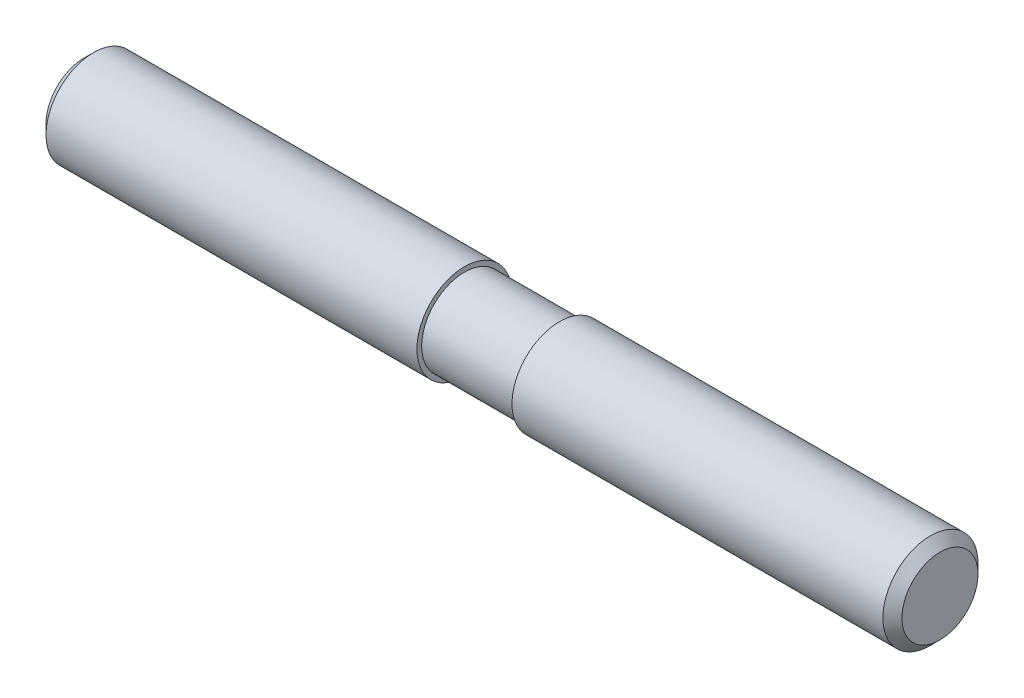
ISO-10303-21;
HEADER;
FILE_DESCRIPTION(('STEP AP214'),'2;1');
FILE_NAME('part.step','',(''),(''),'','','');
FILE_SCHEMA(('AUTOMOTIVE_DESIGN { 1 0 10303 214 1 1 1 1 }'));
ENDSEC;
DATA;
#1=APPLICATION_CONTEXT('core data for automotive mechanical design processes');
#2=APPLICATION_PROTOCOL_DEFINITION('international standard','automotive_design',2000,#1);
#3=PRODUCT_CONTEXT('',#1,'mechanical');
#4=PRODUCT('Part','Part','',(#3));
#5=PRODUCT_RELATED_PRODUCT_CATEGORY('part','',(#4));
#6=PRODUCT_DEFINITION_FORMATION('','',#4);
#7=PRODUCT_DEFINITION_CONTEXT('part definition',#1,'design');
#8=PRODUCT_DEFINITION('design','',#6,#7);
#9=PRODUCT_DEFINITION_SHAPE('','',#8);
#10=(LENGTH_UNIT() NAMED_UNIT(*) SI_UNIT(.MILLI.,.METRE.));
#11=(NAMED_UNIT(*) PLANE_ANGLE_UNIT() SI_UNIT($,.RADIAN.));
#12=(NAMED_UNIT(*) SI_UNIT($,.STERADIAN.) SOLID_ANGLE_UNIT());
#13=UNCERTAINTY_MEASURE_WITH_UNIT(LENGTH_MEASURE(1.E-05),#10,'distance_accuracy_value','');
#14=(GEOMETRIC_REPRESENTATION_CONTEXT(3) GLOBAL_UNCERTAINTY_ASSIGNED_CONTEXT((#13)) GLOBAL_UNIT_ASSIGNED_CONTEXT((#10,
#11,#12)) REPRESENTATION_CONTEXT('',''));
#15=CARTESIAN_POINT('',(0.,0.,0.));
#16=DIRECTION('',(0.,0.,1.));
#17=DIRECTION('',(1.,0.,0.));
#18=AXIS2_PLACEMENT_3D('',#15,#16,#17);
#19=CARTESIAN_POINT('',(-9.,52.9,118.969863647503));
#20=DIRECTION('',(1.,0.,0.));
#21=DIRECTION('',(0.,-0.999989258588651,0.004634944155015));
#22=AXIS2_PLACEMENT_3D('',#19,#20,#21);
#23=CONICAL_SURFACE('',#22,0.8,0.785398163397442);
#24=CARTESIAN_POINT('',(-9.,52.9,118.969863647503));
#25=DIRECTION('',(-1.,0.,0.));
#26=DIRECTION('',(0.,0.999989258588651,-0.004634944155015));
#27=AXIS2_PLACEMENT_3D('',#24,#25,#26);
#28=CIRCLE('',#27,0.8);
#29=CARTESIAN_POINT('',(-9.,53.6999914068709,118.966155692179));
#30=VERTEX_POINT('',#29);
#31=EDGE_CURVE('E83',#30,#30,#28,.T.);
#32=ORIENTED_EDGE('',*,*,#31,.F.);
#33=EDGE_LOOP('',(#32));
#34=FACE_BOUND('',#33,.T.);
#35=CARTESIAN_POINT('',(-8.8,52.9,118.969863647503));
#36=DIRECTION('',(1.,0.,0.));
#37=DIRECTION('',(0.,0.999989258588651,-0.004634944155015));
#38=AXIS2_PLACEMENT_3D('',#35,#36,#37);
#39=CIRCLE('',#38,1.);
#40=CARTESIAN_POINT('',(-8.8,53.8999892585887,118.965228703348));
#41=VERTEX_POINT('',#40);
#42=EDGE_CURVE('E87',#41,#41,#39,.T.);
#43=ORIENTED_EDGE('',*,*,#42,.F.);
#44=EDGE_LOOP('',(#43));
#45=FACE_BOUND('',#44,.T.);
#46=ADVANCED_FACE('F36',(#34,#45),#23,.T.);
#47=CARTESIAN_POINT('',(8.8,52.9,118.969863647503));
#48=DIRECTION('',(-1.,0.,0.));
#49=DIRECTION('',(0.,0.999989258588651,-0.004634944155015));
#50=AXIS2_PLACEMENT_3D('',#47,#48,#49);
#51=CONICAL_SURFACE('',#50,1.,0.785398163397455);
#52=CARTESIAN_POINT('',(9.,52.9,118.969863647503));
#53=DIRECTION('',(1.,0.,0.));
#54=DIRECTION('',(0.,0.999989258588651,-0.004634944155015));
#55=AXIS2_PLACEMENT_3D('',#52,#53,#54);
#56=CIRCLE('',#55,0.8);
#57=CARTESIAN_POINT('',(9.,53.6999914068709,118.966155692179));
#58=VERTEX_POINT('',#57);
#59=EDGE_CURVE('E47',#58,#58,#56,.T.);
#60=ORIENTED_EDGE('',*,*,#59,.F.);
#61=EDGE_LOOP('',(#60));
#62=FACE_BOUND('',#61,.T.);
#63=CARTESIAN_POINT('',(8.8,52.9,118.969863647503));
#64=DIRECTION('',(-1.,0.,0.));
#65=DIRECTION('',(0.,0.999989258588651,-0.004634944155015));
#66=AXIS2_PLACEMENT_3D('',#63,#64,#65);
#67=CIRCLE('',#66,1.);
#68=CARTESIAN_POINT('',(8.8,53.8999892585887,118.965228703348));
#69=VERTEX_POINT('',#68);
#70=EDGE_CURVE('E11',#69,#69,#67,.T.);
#71=ORIENTED_EDGE('',*,*,#70,.F.);
#72=EDGE_LOOP('',(#71));
#73=FACE_BOUND('',#72,.T.);
#74=ADVANCED_FACE('F124',(#62,#73),#51,.T.);
#75=CARTESIAN_POINT('',(-12.,52.9,118.969863647503));
#76=DIRECTION('',(1.,0.,0.));
#77=DIRECTION('',(0.,-0.999989258588651,0.004634944155015));
#78=AXIS2_PLACEMENT_3D('',#75,#76,#77);
#79=CYLINDRICAL_SURFACE('',#78,1.);
#80=ORIENTED_EDGE('',*,*,#70,.T.);
#81=EDGE_LOOP('',(#80));
#82=FACE_BOUND('',#81,.T.);
#83=CARTESIAN_POINT('',(1.,52.9,118.969863647503));
#84=DIRECTION('',(1.,0.,0.));
#85=DIRECTION('',(0.,-0.999989258588651,0.004634944155015));
#86=AXIS2_PLACEMENT_3D('',#83,#84,#85);
#87=CIRCLE('',#86,1.);
#88=CARTESIAN_POINT('',(1.,51.9000107414114,118.974498591658));
#89=VERTEX_POINT('',#88);
#90=EDGE_CURVE('E91',#89,#89,#87,.T.);
#91=ORIENTED_EDGE('',*,*,#90,.T.);
#92=EDGE_LOOP('',(#91));
#93=FACE_BOUND('',#92,.T.);
#94=ADVANCED_FACE('F106',(#82,#93),#79,.T.);
#95=CARTESIAN_POINT('',(9.,52.9,118.969863647503));
#96=DIRECTION('',(-1.,0.,0.));
#97=DIRECTION('',(0.,0.999989258588651,-0.004634944155015));
#98=AXIS2_PLACEMENT_3D('',#95,#96,#97);
#99=PLANE('',#98);
#100=ORIENTED_EDGE('',*,*,#59,.T.);
#101=EDGE_LOOP('',(#100));
#102=FACE_BOUND('',#101,.T.);
#103=ADVANCED_FACE('F120',(#102),#99,.F.);
#104=CARTESIAN_POINT('',(-0.999999999999999,52.9,118.969863647503));
#105=DIRECTION('',(1.,0.,0.));
#106=DIRECTION('',(0.,-0.999989258588651,0.004634944155015));
#107=AXIS2_PLACEMENT_3D('',#104,#105,#106);
#108=CYLINDRICAL_SURFACE('',#107,0.9);
#109=CARTESIAN_POINT('',(-0.999999999999999,52.9,118.969863647503));
#110=DIRECTION('',(1.,0.,0.));
#111=DIRECTION('',(0.,-0.999989258588651,0.004634944155015));
#112=AXIS2_PLACEMENT_3D('',#109,#110,#111);
#113=CIRCLE('',#112,0.9);
#114=CARTESIAN_POINT('',(-0.999999999999999,52.0000096672702,118.974035097243));
#115=VERTEX_POINT('',#114);
#116=EDGE_CURVE('E78',#115,#115,#113,.T.);
#117=ORIENTED_EDGE('',*,*,#116,.T.);
#118=EDGE_LOOP('',(#117));
#119=FACE_BOUND('',#118,.T.);
#120=CARTESIAN_POINT('',(1.,52.9,118.969863647503));
#121=DIRECTION('',(1.,0.,0.));
#122=DIRECTION('',(0.,-0.999989258588651,0.004634944155015));
#123=AXIS2_PLACEMENT_3D('',#120,#121,#122);
#124=CIRCLE('',#123,0.9);
#125=CARTESIAN_POINT('',(1.,52.0000096672702,118.974035097243));
#126=VERTEX_POINT('',#125);
#127=EDGE_CURVE('E98',#126,#126,#124,.T.);
#128=ORIENTED_EDGE('',*,*,#127,.F.);
#129=EDGE_LOOP('',(#128));
#130=FACE_BOUND('',#129,.T.);
#131=ADVANCED_FACE('F111',(#119,#130),#108,.T.);
#132=CARTESIAN_POINT('',(1.,52.9,118.969863647503));
#133=DIRECTION('',(1.,0.,0.));
#134=DIRECTION('',(0.,0.004634944155015,0.999989258588651));
#135=AXIS2_PLACEMENT_3D('',#132,#133,#134);
#136=PLANE('',#135);
#137=ORIENTED_EDGE('',*,*,#127,.T.);
#138=EDGE_LOOP('',(#137));
#139=FACE_BOUND('',#138,.T.);
#140=ORIENTED_EDGE('',*,*,#90,.F.);
#141=EDGE_LOOP('',(#140));
#142=FACE_BOUND('',#141,.T.);
#143=ADVANCED_FACE('F108',(#139,#142),#136,.F.);
#144=CARTESIAN_POINT('',(-0.999999999999999,52.9,118.969863647503));
#145=DIRECTION('',(1.,0.,0.));
#146=DIRECTION('',(0.,0.004634944155015,0.999989258588651));
#147=AXIS2_PLACEMENT_3D('',#144,#145,#146);
#148=PLANE('',#147);
#149=ORIENTED_EDGE('',*,*,#116,.F.);
#150=EDGE_LOOP('',(#149));
#151=FACE_BOUND('',#150,.T.);
#152=CARTESIAN_POINT('',(-0.999999999999999,52.9,118.969863647503));
#153=DIRECTION('',(1.,0.,0.));
#154=DIRECTION('',(0.,-0.999989258588651,0.004634944155015));
#155=AXIS2_PLACEMENT_3D('',#152,#153,#154);
#156=CIRCLE('',#155,1.);
#157=CARTESIAN_POINT('',(-0.999999999999999,51.9000107414114,118.974498591658));
#158=VERTEX_POINT('',#157);
#159=EDGE_CURVE('E40',#158,#158,#156,.T.);
#160=ORIENTED_EDGE('',*,*,#159,.T.);
#161=EDGE_LOOP('',(#160));
#162=FACE_BOUND('',#161,.T.);
#163=ADVANCED_FACE('F110',(#151,#162),#148,.T.);
#164=CARTESIAN_POINT('',(-9.,52.9,118.969863647503));
#165=DIRECTION('',(-1.,0.,0.));
#166=DIRECTION('',(0.,0.999989258588651,-0.004634944155015));
#167=AXIS2_PLACEMENT_3D('',#164,#165,#166);
#168=PLANE('',#167);
#169=ORIENTED_EDGE('',*,*,#31,.T.);
#170=EDGE_LOOP('',(#169));
#171=FACE_BOUND('',#170,.T.);
#172=ADVANCED_FACE('F84',(#171),#168,.T.);
#173=CARTESIAN_POINT('',(-12.,52.9,118.969863647503));
#174=DIRECTION('',(1.,0.,0.));
#175=DIRECTION('',(0.,-0.999989258588651,0.004634944155015));
#176=AXIS2_PLACEMENT_3D('',#173,#174,#175);
#177=CYLINDRICAL_SURFACE('',#176,1.);
#178=ORIENTED_EDGE('',*,*,#42,.T.);
#179=EDGE_LOOP('',(#178));
#180=FACE_BOUND('',#179,.T.);
#181=ORIENTED_EDGE('',*,*,#159,.F.);
#182=EDGE_LOOP('',(#181));
#183=FACE_BOUND('',#182,.T.);
#184=ADVANCED_FACE('F38',(#180,#183),#177,.T.);
#185=CLOSED_SHELL('',(#46,#74,#94,#103,#131,#143,#163,#172,#184));
#186=MANIFOLD_SOLID_BREP('B2',#185);
#187=ADVANCED_BREP_SHAPE_REPRESENTATION('',(#18,#186),#14);
#188=SHAPE_DEFINITION_REPRESENTATION(#9,#187);
ENDSEC;
END-ISO-10303-21;
